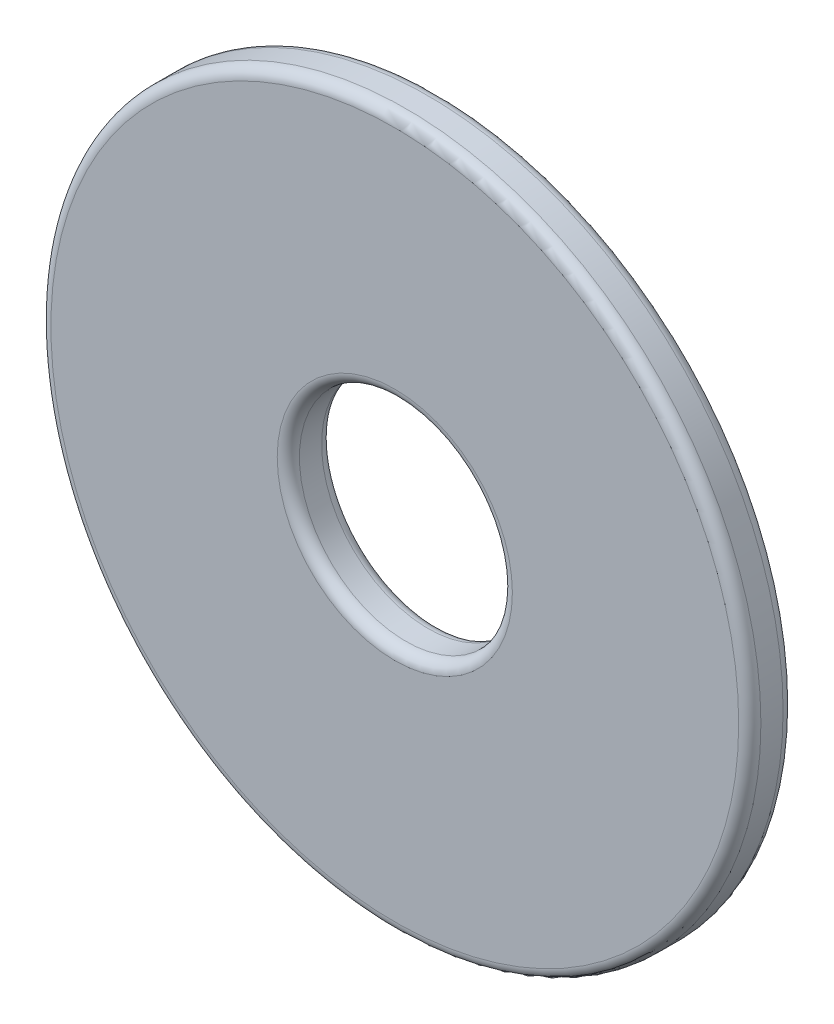
ISO-10303-21;
HEADER;
FILE_DESCRIPTION(('STEP AP214'),'2;1');
FILE_NAME('part.step','',(''),(''),'','','');
FILE_SCHEMA(('AUTOMOTIVE_DESIGN { 1 0 10303 214 1 1 1 1 }'));
ENDSEC;
DATA;
#1=APPLICATION_CONTEXT('core data for automotive mechanical design processes');
#2=APPLICATION_PROTOCOL_DEFINITION('international standard','automotive_design',2000,#1);
#3=PRODUCT_CONTEXT('',#1,'mechanical');
#4=PRODUCT('Part','Part','',(#3));
#5=PRODUCT_RELATED_PRODUCT_CATEGORY('part','',(#4));
#6=PRODUCT_DEFINITION_FORMATION('','',#4);
#7=PRODUCT_DEFINITION_CONTEXT('part definition',#1,'design');
#8=PRODUCT_DEFINITION('design','',#6,#7);
#9=PRODUCT_DEFINITION_SHAPE('','',#8);
#10=(LENGTH_UNIT() NAMED_UNIT(*) SI_UNIT(.MILLI.,.METRE.));
#11=(NAMED_UNIT(*) PLANE_ANGLE_UNIT() SI_UNIT($,.RADIAN.));
#12=(NAMED_UNIT(*) SI_UNIT($,.STERADIAN.) SOLID_ANGLE_UNIT());
#13=UNCERTAINTY_MEASURE_WITH_UNIT(LENGTH_MEASURE(1.E-05),#10,'distance_accuracy_value','');
#14=(GEOMETRIC_REPRESENTATION_CONTEXT(3) GLOBAL_UNCERTAINTY_ASSIGNED_CONTEXT((#13)) GLOBAL_UNIT_ASSIGNED_CONTEXT((#10,
#11,#12)) REPRESENTATION_CONTEXT('',''));
#15=CARTESIAN_POINT('',(0.,0.,0.));
#16=DIRECTION('',(0.,0.,1.));
#17=DIRECTION('',(1.,0.,0.));
#18=AXIS2_PLACEMENT_3D('',#15,#16,#17);
#19=CARTESIAN_POINT('',(0.,0.,1.5875));
#20=DIRECTION('',(0.,0.,1.));
#21=DIRECTION('',(1.,0.,0.));
#22=AXIS2_PLACEMENT_3D('',#19,#20,#21);
#23=PLANE('',#22);
#24=CARTESIAN_POINT('',(0.,0.,1.5875));
#25=DIRECTION('',(0.,0.,1.));
#26=DIRECTION('',(1.,0.,0.));
#27=AXIS2_PLACEMENT_3D('',#24,#25,#26);
#28=CIRCLE('',#27,4.206875);
#29=CARTESIAN_POINT('',(4.206875,0.,1.5875));
#30=VERTEX_POINT('',#29);
#31=EDGE_CURVE('E10',#30,#30,#28,.F.);
#32=ORIENTED_EDGE('',*,*,#31,.T.);
#33=EDGE_LOOP('',(#32));
#34=FACE_BOUND('',#33,.T.);
#35=CARTESIAN_POINT('',(0.,0.,1.5875));
#36=DIRECTION('',(0.,0.,1.));
#37=DIRECTION('',(1.,0.,0.));
#38=AXIS2_PLACEMENT_3D('',#35,#36,#37);
#39=CIRCLE('',#38,12.303125);
#40=CARTESIAN_POINT('',(12.303125,0.,1.5875));
#41=VERTEX_POINT('',#40);
#42=EDGE_CURVE('E45',#41,#41,#39,.T.);
#43=ORIENTED_EDGE('',*,*,#42,.T.);
#44=EDGE_LOOP('',(#43));
#45=FACE_BOUND('',#44,.T.);
#46=ADVANCED_FACE('F37',(#34,#45),#23,.T.);
#47=CARTESIAN_POINT('',(0.,0.,0.));
#48=DIRECTION('',(0.,0.,1.));
#49=DIRECTION('',(1.,0.,0.));
#50=AXIS2_PLACEMENT_3D('',#47,#48,#49);
#51=PLANE('',#50);
#52=CARTESIAN_POINT('',(0.,0.,0.));
#53=DIRECTION('',(0.,0.,1.));
#54=DIRECTION('',(1.,0.,0.));
#55=AXIS2_PLACEMENT_3D('',#52,#53,#54);
#56=CIRCLE('',#55,4.206875);
#57=CARTESIAN_POINT('',(4.206875,0.,0.));
#58=VERTEX_POINT('',#57);
#59=EDGE_CURVE('E69',#58,#58,#56,.T.);
#60=ORIENTED_EDGE('',*,*,#59,.T.);
#61=EDGE_LOOP('',(#60));
#62=FACE_BOUND('',#61,.T.);
#63=CARTESIAN_POINT('',(0.,0.,0.));
#64=DIRECTION('',(0.,0.,1.));
#65=DIRECTION('',(1.,0.,0.));
#66=AXIS2_PLACEMENT_3D('',#63,#64,#65);
#67=CIRCLE('',#66,12.303125);
#68=CARTESIAN_POINT('',(12.303125,0.,0.));
#69=VERTEX_POINT('',#68);
#70=EDGE_CURVE('E73',#69,#69,#67,.F.);
#71=ORIENTED_EDGE('',*,*,#70,.T.);
#72=EDGE_LOOP('',(#71));
#73=FACE_BOUND('',#72,.T.);
#74=ADVANCED_FACE('F78',(#62,#73),#51,.F.);
#75=CARTESIAN_POINT('',(0.,0.,1.5875));
#76=DIRECTION('',(0.,0.,-1.));
#77=DIRECTION('',(-1.,0.,0.));
#78=AXIS2_PLACEMENT_3D('',#75,#76,#77);
#79=CYLINDRICAL_SURFACE('',#78,12.7);
#80=CARTESIAN_POINT('',(0.,0.,0.396875));
#81=DIRECTION('',(0.,0.,1.));
#82=DIRECTION('',(1.,0.,0.));
#83=AXIS2_PLACEMENT_3D('',#80,#81,#82);
#84=CIRCLE('',#83,12.7);
#85=CARTESIAN_POINT('',(12.7,0.,0.396875));
#86=VERTEX_POINT('',#85);
#87=EDGE_CURVE('E50',#86,#86,#84,.T.);
#88=ORIENTED_EDGE('',*,*,#87,.T.);
#89=EDGE_LOOP('',(#88));
#90=FACE_BOUND('',#89,.T.);
#91=CARTESIAN_POINT('',(0.,0.,1.190625));
#92=DIRECTION('',(0.,0.,1.));
#93=DIRECTION('',(1.,0.,0.));
#94=AXIS2_PLACEMENT_3D('',#91,#92,#93);
#95=CIRCLE('',#94,12.7);
#96=CARTESIAN_POINT('',(12.7,0.,1.190625));
#97=VERTEX_POINT('',#96);
#98=EDGE_CURVE('E55',#97,#97,#95,.F.);
#99=ORIENTED_EDGE('',*,*,#98,.T.);
#100=EDGE_LOOP('',(#99));
#101=FACE_BOUND('',#100,.T.);
#102=ADVANCED_FACE('F88',(#90,#101),#79,.T.);
#103=CARTESIAN_POINT('',(0.,0.,1.5875));
#104=DIRECTION('',(0.,0.,-1.));
#105=DIRECTION('',(-1.,0.,0.));
#106=AXIS2_PLACEMENT_3D('',#103,#104,#105);
#107=CYLINDRICAL_SURFACE('',#106,3.81);
#108=CARTESIAN_POINT('',(0.,0.,0.396875));
#109=DIRECTION('',(0.,0.,1.));
#110=DIRECTION('',(1.,0.,0.));
#111=AXIS2_PLACEMENT_3D('',#108,#109,#110);
#112=CIRCLE('',#111,3.81);
#113=CARTESIAN_POINT('',(3.81,0.,0.396875));
#114=VERTEX_POINT('',#113);
#115=EDGE_CURVE('E61',#114,#114,#112,.F.);
#116=ORIENTED_EDGE('',*,*,#115,.T.);
#117=EDGE_LOOP('',(#116));
#118=FACE_BOUND('',#117,.T.);
#119=CARTESIAN_POINT('',(0.,0.,1.190625));
#120=DIRECTION('',(0.,0.,1.));
#121=DIRECTION('',(1.,0.,0.));
#122=AXIS2_PLACEMENT_3D('',#119,#120,#121);
#123=CIRCLE('',#122,3.81);
#124=CARTESIAN_POINT('',(3.81,0.,1.190625));
#125=VERTEX_POINT('',#124);
#126=EDGE_CURVE('E65',#125,#125,#123,.T.);
#127=ORIENTED_EDGE('',*,*,#126,.T.);
#128=EDGE_LOOP('',(#127));
#129=FACE_BOUND('',#128,.T.);
#130=ADVANCED_FACE('F91',(#118,#129),#107,.F.);
#131=CARTESIAN_POINT('',(0.,0.,0.396875));
#132=DIRECTION('',(0.,0.,1.));
#133=DIRECTION('',(1.,0.,0.));
#134=AXIS2_PLACEMENT_3D('',#131,#132,#133);
#135=TOROIDAL_SURFACE('',#134,4.206875,0.396875);
#136=ORIENTED_EDGE('',*,*,#115,.F.);
#137=EDGE_LOOP('',(#136));
#138=FACE_BOUND('',#137,.T.);
#139=ORIENTED_EDGE('',*,*,#59,.F.);
#140=EDGE_LOOP('',(#139));
#141=FACE_BOUND('',#140,.T.);
#142=ADVANCED_FACE('F84',(#138,#141),#135,.T.);
#143=CARTESIAN_POINT('',(0.,0.,0.396875));
#144=DIRECTION('',(0.,0.,1.));
#145=DIRECTION('',(1.,0.,0.));
#146=AXIS2_PLACEMENT_3D('',#143,#144,#145);
#147=TOROIDAL_SURFACE('',#146,12.303125,0.396875);
#148=ORIENTED_EDGE('',*,*,#70,.F.);
#149=EDGE_LOOP('',(#148));
#150=FACE_BOUND('',#149,.T.);
#151=ORIENTED_EDGE('',*,*,#87,.F.);
#152=EDGE_LOOP('',(#151));
#153=FACE_BOUND('',#152,.T.);
#154=ADVANCED_FACE('F80',(#150,#153),#147,.T.);
#155=CARTESIAN_POINT('',(0.,0.,1.190625));
#156=DIRECTION('',(0.,0.,1.));
#157=DIRECTION('',(1.,0.,0.));
#158=AXIS2_PLACEMENT_3D('',#155,#156,#157);
#159=TOROIDAL_SURFACE('',#158,4.206875,0.396875);
#160=ORIENTED_EDGE('',*,*,#31,.F.);
#161=EDGE_LOOP('',(#160));
#162=FACE_BOUND('',#161,.T.);
#163=ORIENTED_EDGE('',*,*,#126,.F.);
#164=EDGE_LOOP('',(#163));
#165=FACE_BOUND('',#164,.T.);
#166=ADVANCED_FACE('F83',(#162,#165),#159,.T.);
#167=CARTESIAN_POINT('',(0.,0.,1.190625));
#168=DIRECTION('',(0.,0.,1.));
#169=DIRECTION('',(1.,0.,0.));
#170=AXIS2_PLACEMENT_3D('',#167,#168,#169);
#171=TOROIDAL_SURFACE('',#170,12.303125,0.396875);
#172=ORIENTED_EDGE('',*,*,#98,.F.);
#173=EDGE_LOOP('',(#172));
#174=FACE_BOUND('',#173,.T.);
#175=ORIENTED_EDGE('',*,*,#42,.F.);
#176=EDGE_LOOP('',(#175));
#177=FACE_BOUND('',#176,.T.);
#178=ADVANCED_FACE('F39',(#174,#177),#171,.T.);
#179=CLOSED_SHELL('',(#46,#74,#102,#130,#142,#154,#166,#178));
#180=MANIFOLD_SOLID_BREP('B2',#179);
#181=ADVANCED_BREP_SHAPE_REPRESENTATION('',(#18,#180),#14);
#182=SHAPE_DEFINITION_REPRESENTATION(#9,#181);
ENDSEC;
END-ISO-10303-21;
